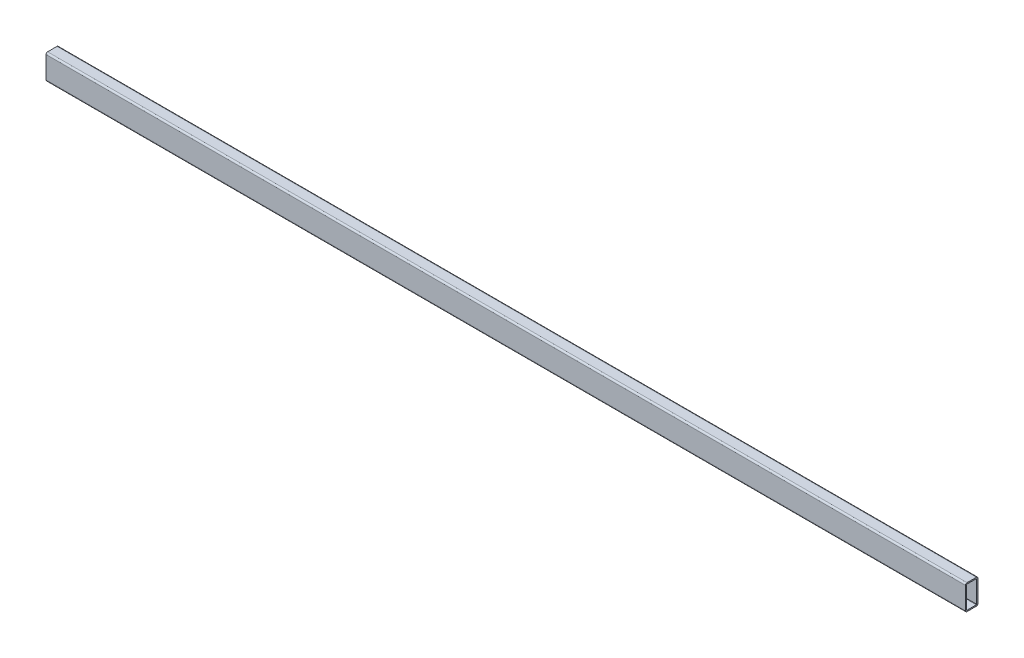
ISO-10303-21;
HEADER;
FILE_DESCRIPTION(('STEP AP214'),'2;1');
FILE_NAME('part.step','',(''),(''),'','','');
FILE_SCHEMA(('AUTOMOTIVE_DESIGN { 1 0 10303 214 1 1 1 1 }'));
ENDSEC;
DATA;
#1=APPLICATION_CONTEXT('core data for automotive mechanical design processes');
#2=APPLICATION_PROTOCOL_DEFINITION('international standard','automotive_design',2000,#1);
#3=PRODUCT_CONTEXT('',#1,'mechanical');
#4=PRODUCT('Part','Part','',(#3));
#5=PRODUCT_RELATED_PRODUCT_CATEGORY('part','',(#4));
#6=PRODUCT_DEFINITION_FORMATION('','',#4);
#7=PRODUCT_DEFINITION_CONTEXT('part definition',#1,'design');
#8=PRODUCT_DEFINITION('design','',#6,#7);
#9=PRODUCT_DEFINITION_SHAPE('','',#8);
#10=(LENGTH_UNIT() NAMED_UNIT(*) SI_UNIT(.MILLI.,.METRE.));
#11=(NAMED_UNIT(*) PLANE_ANGLE_UNIT() SI_UNIT($,.RADIAN.));
#12=(NAMED_UNIT(*) SI_UNIT($,.STERADIAN.) SOLID_ANGLE_UNIT());
#13=UNCERTAINTY_MEASURE_WITH_UNIT(LENGTH_MEASURE(1.E-05),#10,'distance_accuracy_value','');
#14=(GEOMETRIC_REPRESENTATION_CONTEXT(3) GLOBAL_UNCERTAINTY_ASSIGNED_CONTEXT((#13)) GLOBAL_UNIT_ASSIGNED_CONTEXT((#10,
#11,#12)) REPRESENTATION_CONTEXT('',''));
#15=CARTESIAN_POINT('',(0.,0.,0.));
#16=DIRECTION('',(0.,0.,1.));
#17=DIRECTION('',(1.,0.,0.));
#18=AXIS2_PLACEMENT_3D('',#15,#16,#17);
#19=CARTESIAN_POINT('',(732.5,17.5,7.5));
#20=DIRECTION('',(-1.,0.,0.));
#21=DIRECTION('',(0.,0.,1.));
#22=AXIS2_PLACEMENT_3D('',#19,#20,#21);
#23=CYLINDRICAL_SURFACE('',#22,2.5);
#24=CARTESIAN_POINT('',(-732.5,17.5,7.5));
#25=DIRECTION('',(1.,0.,0.));
#26=DIRECTION('',(0.,0.,-1.));
#27=AXIS2_PLACEMENT_3D('',#24,#25,#26);
#28=CIRCLE('',#27,2.5);
#29=CARTESIAN_POINT('',(-732.5,20.,7.5));
#30=VERTEX_POINT('',#29);
#31=CARTESIAN_POINT('',(-732.5,17.5,10.));
#32=VERTEX_POINT('',#31);
#33=EDGE_CURVE('E210',#30,#32,#28,.T.);
#34=ORIENTED_EDGE('',*,*,#33,.T.);
#35=DIRECTION('',(-1.,0.,0.));
#36=VECTOR('',#35,1.);
#37=CARTESIAN_POINT('',(732.5,17.5,10.));
#38=LINE('',#37,#36);
#39=CARTESIAN_POINT('',(732.5,17.5,10.));
#40=VERTEX_POINT('',#39);
#41=EDGE_CURVE('E11',#40,#32,#38,.T.);
#42=ORIENTED_EDGE('',*,*,#41,.F.);
#43=CARTESIAN_POINT('',(732.5,17.5,7.5));
#44=DIRECTION('',(1.,0.,0.));
#45=DIRECTION('',(0.,0.,-1.));
#46=AXIS2_PLACEMENT_3D('',#43,#44,#45);
#47=CIRCLE('',#46,2.5);
#48=CARTESIAN_POINT('',(732.5,20.,7.5));
#49=VERTEX_POINT('',#48);
#50=EDGE_CURVE('E288',#49,#40,#47,.T.);
#51=ORIENTED_EDGE('',*,*,#50,.F.);
#52=DIRECTION('',(-1.,0.,0.));
#53=VECTOR('',#52,1.);
#54=CARTESIAN_POINT('',(732.5,20.,7.5));
#55=LINE('',#54,#53);
#56=EDGE_CURVE('E225',#49,#30,#55,.T.);
#57=ORIENTED_EDGE('',*,*,#56,.T.);
#58=EDGE_LOOP('',(#34,#42,#51,#57));
#59=FACE_BOUND('',#58,.T.);
#60=ADVANCED_FACE('F38',(#59),#23,.T.);
#61=CARTESIAN_POINT('',(732.5,17.5,10.));
#62=DIRECTION('',(0.,0.,-1.));
#63=DIRECTION('',(-1.,0.,0.));
#64=AXIS2_PLACEMENT_3D('',#61,#62,#63);
#65=PLANE('',#64);
#66=DIRECTION('',(0.,-1.,0.));
#67=VECTOR('',#66,1.);
#68=CARTESIAN_POINT('',(-732.5,17.5,10.));
#69=LINE('',#68,#67);
#70=CARTESIAN_POINT('',(-732.5,-17.5,10.));
#71=VERTEX_POINT('',#70);
#72=EDGE_CURVE('E213',#32,#71,#69,.T.);
#73=ORIENTED_EDGE('',*,*,#72,.T.);
#74=DIRECTION('',(-1.,0.,0.));
#75=VECTOR('',#74,1.);
#76=CARTESIAN_POINT('',(732.5,-17.5,10.));
#77=LINE('',#76,#75);
#78=CARTESIAN_POINT('',(732.5,-17.5,10.));
#79=VERTEX_POINT('',#78);
#80=EDGE_CURVE('E48',#79,#71,#77,.T.);
#81=ORIENTED_EDGE('',*,*,#80,.F.);
#82=DIRECTION('',(0.,-1.,0.));
#83=VECTOR('',#82,1.);
#84=CARTESIAN_POINT('',(732.5,17.5,10.));
#85=LINE('',#84,#83);
#86=EDGE_CURVE('E290',#40,#79,#85,.T.);
#87=ORIENTED_EDGE('',*,*,#86,.F.);
#88=ORIENTED_EDGE('',*,*,#41,.T.);
#89=EDGE_LOOP('',(#73,#81,#87,#88));
#90=FACE_BOUND('',#89,.T.);
#91=ADVANCED_FACE('F325',(#90),#65,.F.);
#92=CARTESIAN_POINT('',(732.5,-17.5,7.5));
#93=DIRECTION('',(-1.,0.,0.));
#94=DIRECTION('',(0.,0.,1.));
#95=AXIS2_PLACEMENT_3D('',#92,#93,#94);
#96=CYLINDRICAL_SURFACE('',#95,2.5);
#97=CARTESIAN_POINT('',(-732.5,-17.5,7.5));
#98=DIRECTION('',(1.,0.,0.));
#99=DIRECTION('',(0.,0.,-1.));
#100=AXIS2_PLACEMENT_3D('',#97,#98,#99);
#101=CIRCLE('',#100,2.5);
#102=CARTESIAN_POINT('',(-732.5,-20.,7.5));
#103=VERTEX_POINT('',#102);
#104=EDGE_CURVE('E215',#71,#103,#101,.T.);
#105=ORIENTED_EDGE('',*,*,#104,.T.);
#106=DIRECTION('',(-1.,0.,0.));
#107=VECTOR('',#106,1.);
#108=CARTESIAN_POINT('',(732.5,-20.,7.5));
#109=LINE('',#108,#107);
#110=CARTESIAN_POINT('',(732.5,-20.,7.5));
#111=VERTEX_POINT('',#110);
#112=EDGE_CURVE('E232',#111,#103,#109,.T.);
#113=ORIENTED_EDGE('',*,*,#112,.F.);
#114=CARTESIAN_POINT('',(732.5,-17.5,7.5));
#115=DIRECTION('',(1.,0.,0.));
#116=DIRECTION('',(0.,0.,-1.));
#117=AXIS2_PLACEMENT_3D('',#114,#115,#116);
#118=CIRCLE('',#117,2.5);
#119=EDGE_CURVE('E292',#79,#111,#118,.T.);
#120=ORIENTED_EDGE('',*,*,#119,.F.);
#121=ORIENTED_EDGE('',*,*,#80,.T.);
#122=EDGE_LOOP('',(#105,#113,#120,#121));
#123=FACE_BOUND('',#122,.T.);
#124=ADVANCED_FACE('F330',(#123),#96,.T.);
#125=CARTESIAN_POINT('',(732.5,-20.,-7.5));
#126=DIRECTION('',(0.,1.,0.));
#127=DIRECTION('',(0.,0.,1.));
#128=AXIS2_PLACEMENT_3D('',#125,#126,#127);
#129=PLANE('',#128);
#130=DIRECTION('',(0.,0.,-1.));
#131=VECTOR('',#130,1.);
#132=CARTESIAN_POINT('',(-732.5,-20.,-7.5));
#133=LINE('',#132,#131);
#134=CARTESIAN_POINT('',(-732.5,-20.,-7.5));
#135=VERTEX_POINT('',#134);
#136=EDGE_CURVE('E217',#103,#135,#133,.T.);
#137=ORIENTED_EDGE('',*,*,#136,.T.);
#138=DIRECTION('',(-1.,0.,0.));
#139=VECTOR('',#138,1.);
#140=CARTESIAN_POINT('',(732.5,-20.,-7.5));
#141=LINE('',#140,#139);
#142=CARTESIAN_POINT('',(732.5,-20.,-7.5));
#143=VERTEX_POINT('',#142);
#144=EDGE_CURVE('E229',#143,#135,#141,.T.);
#145=ORIENTED_EDGE('',*,*,#144,.F.);
#146=DIRECTION('',(0.,0.,-1.));
#147=VECTOR('',#146,1.);
#148=CARTESIAN_POINT('',(732.5,-20.,-7.5));
#149=LINE('',#148,#147);
#150=EDGE_CURVE('E294',#111,#143,#149,.T.);
#151=ORIENTED_EDGE('',*,*,#150,.F.);
#152=ORIENTED_EDGE('',*,*,#112,.T.);
#153=EDGE_LOOP('',(#137,#145,#151,#152));
#154=FACE_BOUND('',#153,.T.);
#155=ADVANCED_FACE('F300',(#154),#129,.F.);
#156=CARTESIAN_POINT('',(732.5,-17.5,-7.5));
#157=DIRECTION('',(-1.,0.,0.));
#158=DIRECTION('',(0.,0.,1.));
#159=AXIS2_PLACEMENT_3D('',#156,#157,#158);
#160=CYLINDRICAL_SURFACE('',#159,2.5);
#161=CARTESIAN_POINT('',(-732.5,-17.5,-7.5));
#162=DIRECTION('',(1.,0.,0.));
#163=DIRECTION('',(0.,0.,-1.));
#164=AXIS2_PLACEMENT_3D('',#161,#162,#163);
#165=CIRCLE('',#164,2.5);
#166=CARTESIAN_POINT('',(-732.5,-17.5,-10.));
#167=VERTEX_POINT('',#166);
#168=EDGE_CURVE('E219',#135,#167,#165,.T.);
#169=ORIENTED_EDGE('',*,*,#168,.T.);
#170=DIRECTION('',(-1.,0.,0.));
#171=VECTOR('',#170,1.);
#172=CARTESIAN_POINT('',(732.5,-17.5,-10.));
#173=LINE('',#172,#171);
#174=CARTESIAN_POINT('',(732.5,-17.5,-10.));
#175=VERTEX_POINT('',#174);
#176=EDGE_CURVE('E177',#175,#167,#173,.T.);
#177=ORIENTED_EDGE('',*,*,#176,.F.);
#178=CARTESIAN_POINT('',(732.5,-17.5,-7.5));
#179=DIRECTION('',(1.,0.,0.));
#180=DIRECTION('',(0.,0.,-1.));
#181=AXIS2_PLACEMENT_3D('',#178,#179,#180);
#182=CIRCLE('',#181,2.5);
#183=EDGE_CURVE('E168',#143,#175,#182,.T.);
#184=ORIENTED_EDGE('',*,*,#183,.F.);
#185=ORIENTED_EDGE('',*,*,#144,.T.);
#186=EDGE_LOOP('',(#169,#177,#184,#185));
#187=FACE_BOUND('',#186,.T.);
#188=ADVANCED_FACE('F304',(#187),#160,.T.);
#189=CARTESIAN_POINT('',(732.5,-17.5,-10.));
#190=DIRECTION('',(0.,0.,1.));
#191=DIRECTION('',(1.,0.,0.));
#192=AXIS2_PLACEMENT_3D('',#189,#190,#191);
#193=PLANE('',#192);
#194=DIRECTION('',(0.,1.,0.));
#195=VECTOR('',#194,1.);
#196=CARTESIAN_POINT('',(-732.5,-17.5,-10.));
#197=LINE('',#196,#195);
#198=CARTESIAN_POINT('',(-732.5,17.5,-10.));
#199=VERTEX_POINT('',#198);
#200=EDGE_CURVE('E176',#167,#199,#197,.T.);
#201=ORIENTED_EDGE('',*,*,#200,.T.);
#202=DIRECTION('',(-1.,0.,0.));
#203=VECTOR('',#202,1.);
#204=CARTESIAN_POINT('',(732.5,17.5,-10.));
#205=LINE('',#204,#203);
#206=CARTESIAN_POINT('',(732.5,17.5,-10.));
#207=VERTEX_POINT('',#206);
#208=EDGE_CURVE('E173',#207,#199,#205,.T.);
#209=ORIENTED_EDGE('',*,*,#208,.F.);
#210=DIRECTION('',(0.,1.,0.));
#211=VECTOR('',#210,1.);
#212=CARTESIAN_POINT('',(732.5,-17.5,-10.));
#213=LINE('',#212,#211);
#214=EDGE_CURVE('E162',#175,#207,#213,.T.);
#215=ORIENTED_EDGE('',*,*,#214,.F.);
#216=ORIENTED_EDGE('',*,*,#176,.T.);
#217=EDGE_LOOP('',(#201,#209,#215,#216));
#218=FACE_BOUND('',#217,.T.);
#219=ADVANCED_FACE('F174',(#218),#193,.F.);
#220=CARTESIAN_POINT('',(732.5,17.5,-7.5));
#221=DIRECTION('',(-1.,0.,0.));
#222=DIRECTION('',(0.,0.,1.));
#223=AXIS2_PLACEMENT_3D('',#220,#221,#222);
#224=CYLINDRICAL_SURFACE('',#223,2.5);
#225=CARTESIAN_POINT('',(-732.5,17.5,-7.5));
#226=DIRECTION('',(1.,0.,0.));
#227=DIRECTION('',(0.,0.,-1.));
#228=AXIS2_PLACEMENT_3D('',#225,#226,#227);
#229=CIRCLE('',#228,2.5);
#230=CARTESIAN_POINT('',(-732.5,20.,-7.5));
#231=VERTEX_POINT('',#230);
#232=EDGE_CURVE('E110',#199,#231,#229,.T.);
#233=ORIENTED_EDGE('',*,*,#232,.T.);
#234=DIRECTION('',(-1.,0.,0.));
#235=VECTOR('',#234,1.);
#236=CARTESIAN_POINT('',(732.5,20.,-7.5));
#237=LINE('',#236,#235);
#238=CARTESIAN_POINT('',(732.5,20.,-7.5));
#239=VERTEX_POINT('',#238);
#240=EDGE_CURVE('E178',#239,#231,#237,.T.);
#241=ORIENTED_EDGE('',*,*,#240,.F.);
#242=CARTESIAN_POINT('',(732.5,17.5,-7.5));
#243=DIRECTION('',(1.,0.,0.));
#244=DIRECTION('',(0.,0.,-1.));
#245=AXIS2_PLACEMENT_3D('',#242,#243,#244);
#246=CIRCLE('',#245,2.5);
#247=EDGE_CURVE('E166',#207,#239,#246,.T.);
#248=ORIENTED_EDGE('',*,*,#247,.F.);
#249=ORIENTED_EDGE('',*,*,#208,.T.);
#250=EDGE_LOOP('',(#233,#241,#248,#249));
#251=FACE_BOUND('',#250,.T.);
#252=ADVANCED_FACE('F180',(#251),#224,.T.);
#253=CARTESIAN_POINT('',(732.5,-17.5,7.5));
#254=DIRECTION('',(-1.,0.,0.));
#255=DIRECTION('',(0.,0.,1.));
#256=AXIS2_PLACEMENT_3D('',#253,#254,#255);
#257=CYLINDRICAL_SURFACE('',#256,0.499999999999998);
#258=CARTESIAN_POINT('',(-732.5,-17.5,7.5));
#259=DIRECTION('',(1.,0.,0.));
#260=DIRECTION('',(0.,0.,-1.));
#261=AXIS2_PLACEMENT_3D('',#258,#259,#260);
#262=CIRCLE('',#261,0.499999999999998);
#263=CARTESIAN_POINT('',(-732.5,-17.5,8.));
#264=VERTEX_POINT('',#263);
#265=CARTESIAN_POINT('',(-732.5,-18.,7.5));
#266=VERTEX_POINT('',#265);
#267=EDGE_CURVE('E186',#264,#266,#262,.T.);
#268=ORIENTED_EDGE('',*,*,#267,.F.);
#269=DIRECTION('',(-1.,0.,0.));
#270=VECTOR('',#269,1.);
#271=CARTESIAN_POINT('',(732.5,-17.5,8.));
#272=LINE('',#271,#270);
#273=CARTESIAN_POINT('',(732.5,-17.5,8.));
#274=VERTEX_POINT('',#273);
#275=EDGE_CURVE('E42',#274,#264,#272,.T.);
#276=ORIENTED_EDGE('',*,*,#275,.F.);
#277=CARTESIAN_POINT('',(732.5,-17.5,7.5));
#278=DIRECTION('',(1.,0.,0.));
#279=DIRECTION('',(0.,0.,-1.));
#280=AXIS2_PLACEMENT_3D('',#277,#278,#279);
#281=CIRCLE('',#280,0.499999999999998);
#282=CARTESIAN_POINT('',(732.5,-18.,7.5));
#283=VERTEX_POINT('',#282);
#284=EDGE_CURVE('E224',#274,#283,#281,.T.);
#285=ORIENTED_EDGE('',*,*,#284,.T.);
#286=DIRECTION('',(-1.,0.,0.));
#287=VECTOR('',#286,1.);
#288=CARTESIAN_POINT('',(732.5,-18.,7.5));
#289=LINE('',#288,#287);
#290=EDGE_CURVE('E182',#283,#266,#289,.T.);
#291=ORIENTED_EDGE('',*,*,#290,.T.);
#292=EDGE_LOOP('',(#268,#276,#285,#291));
#293=FACE_BOUND('',#292,.T.);
#294=ADVANCED_FACE('F40',(#293),#257,.F.);
#295=CARTESIAN_POINT('',(732.5,17.5,8.));
#296=DIRECTION('',(0.,0.,-1.));
#297=DIRECTION('',(-1.,0.,0.));
#298=AXIS2_PLACEMENT_3D('',#295,#296,#297);
#299=PLANE('',#298);
#300=DIRECTION('',(0.,-1.,0.));
#301=VECTOR('',#300,1.);
#302=CARTESIAN_POINT('',(-732.5,17.5,8.));
#303=LINE('',#302,#301);
#304=CARTESIAN_POINT('',(-732.5,17.5,8.));
#305=VERTEX_POINT('',#304);
#306=EDGE_CURVE('E189',#305,#264,#303,.T.);
#307=ORIENTED_EDGE('',*,*,#306,.F.);
#308=DIRECTION('',(-1.,0.,0.));
#309=VECTOR('',#308,1.);
#310=CARTESIAN_POINT('',(732.5,17.5,8.));
#311=LINE('',#310,#309);
#312=CARTESIAN_POINT('',(732.5,17.5,8.));
#313=VERTEX_POINT('',#312);
#314=EDGE_CURVE('E247',#313,#305,#311,.T.);
#315=ORIENTED_EDGE('',*,*,#314,.F.);
#316=DIRECTION('',(0.,-1.,0.));
#317=VECTOR('',#316,1.);
#318=CARTESIAN_POINT('',(732.5,17.5,8.));
#319=LINE('',#318,#317);
#320=EDGE_CURVE('E256',#313,#274,#319,.T.);
#321=ORIENTED_EDGE('',*,*,#320,.T.);
#322=ORIENTED_EDGE('',*,*,#275,.T.);
#323=EDGE_LOOP('',(#307,#315,#321,#322));
#324=FACE_BOUND('',#323,.T.);
#325=ADVANCED_FACE('F254',(#324),#299,.T.);
#326=CARTESIAN_POINT('',(732.5,17.5,7.5));
#327=DIRECTION('',(-1.,0.,0.));
#328=DIRECTION('',(0.,0.,1.));
#329=AXIS2_PLACEMENT_3D('',#326,#327,#328);
#330=CYLINDRICAL_SURFACE('',#329,0.499999999999998);
#331=CARTESIAN_POINT('',(-732.5,17.5,7.5));
#332=DIRECTION('',(1.,0.,0.));
#333=DIRECTION('',(0.,0.,-1.));
#334=AXIS2_PLACEMENT_3D('',#331,#332,#333);
#335=CIRCLE('',#334,0.499999999999998);
#336=CARTESIAN_POINT('',(-732.5,18.,7.5));
#337=VERTEX_POINT('',#336);
#338=EDGE_CURVE('E192',#337,#305,#335,.T.);
#339=ORIENTED_EDGE('',*,*,#338,.F.);
#340=DIRECTION('',(-1.,0.,0.));
#341=VECTOR('',#340,1.);
#342=CARTESIAN_POINT('',(732.5,18.,7.5));
#343=LINE('',#342,#341);
#344=CARTESIAN_POINT('',(732.5,18.,7.5));
#345=VERTEX_POINT('',#344);
#346=EDGE_CURVE('E246',#345,#337,#343,.T.);
#347=ORIENTED_EDGE('',*,*,#346,.F.);
#348=CARTESIAN_POINT('',(732.5,17.5,7.5));
#349=DIRECTION('',(1.,0.,0.));
#350=DIRECTION('',(0.,0.,-1.));
#351=AXIS2_PLACEMENT_3D('',#348,#349,#350);
#352=CIRCLE('',#351,0.499999999999998);
#353=EDGE_CURVE('E264',#345,#313,#352,.T.);
#354=ORIENTED_EDGE('',*,*,#353,.T.);
#355=ORIENTED_EDGE('',*,*,#314,.T.);
#356=EDGE_LOOP('',(#339,#347,#354,#355));
#357=FACE_BOUND('',#356,.T.);
#358=ADVANCED_FACE('F262',(#357),#330,.F.);
#359=CARTESIAN_POINT('',(732.5,18.,7.5));
#360=DIRECTION('',(0.,-1.,0.));
#361=DIRECTION('',(0.,0.,-1.));
#362=AXIS2_PLACEMENT_3D('',#359,#360,#361);
#363=PLANE('',#362);
#364=DIRECTION('',(0.,0.,1.));
#365=VECTOR('',#364,1.);
#366=CARTESIAN_POINT('',(-732.5,18.,7.5));
#367=LINE('',#366,#365);
#368=CARTESIAN_POINT('',(-732.5,18.,-7.5));
#369=VERTEX_POINT('',#368);
#370=EDGE_CURVE('E195',#369,#337,#367,.T.);
#371=ORIENTED_EDGE('',*,*,#370,.F.);
#372=DIRECTION('',(-1.,0.,0.));
#373=VECTOR('',#372,1.);
#374=CARTESIAN_POINT('',(732.5,18.,-7.5));
#375=LINE('',#374,#373);
#376=CARTESIAN_POINT('',(732.5,18.,-7.5));
#377=VERTEX_POINT('',#376);
#378=EDGE_CURVE('E244',#377,#369,#375,.T.);
#379=ORIENTED_EDGE('',*,*,#378,.F.);
#380=DIRECTION('',(0.,0.,1.));
#381=VECTOR('',#380,1.);
#382=CARTESIAN_POINT('',(732.5,18.,7.5));
#383=LINE('',#382,#381);
#384=EDGE_CURVE('E270',#377,#345,#383,.T.);
#385=ORIENTED_EDGE('',*,*,#384,.T.);
#386=ORIENTED_EDGE('',*,*,#346,.T.);
#387=EDGE_LOOP('',(#371,#379,#385,#386));
#388=FACE_BOUND('',#387,.T.);
#389=ADVANCED_FACE('F273',(#388),#363,.T.);
#390=CARTESIAN_POINT('',(732.5,17.5,-7.5));
#391=DIRECTION('',(-1.,0.,0.));
#392=DIRECTION('',(0.,0.,1.));
#393=AXIS2_PLACEMENT_3D('',#390,#391,#392);
#394=CYLINDRICAL_SURFACE('',#393,0.499999999999998);
#395=CARTESIAN_POINT('',(-732.5,17.5,-7.5));
#396=DIRECTION('',(1.,0.,0.));
#397=DIRECTION('',(0.,0.,-1.));
#398=AXIS2_PLACEMENT_3D('',#395,#396,#397);
#399=CIRCLE('',#398,0.499999999999998);
#400=CARTESIAN_POINT('',(-732.5,17.5,-8.));
#401=VERTEX_POINT('',#400);
#402=EDGE_CURVE('E198',#401,#369,#399,.T.);
#403=ORIENTED_EDGE('',*,*,#402,.F.);
#404=DIRECTION('',(-1.,0.,0.));
#405=VECTOR('',#404,1.);
#406=CARTESIAN_POINT('',(732.5,17.5,-8.));
#407=LINE('',#406,#405);
#408=CARTESIAN_POINT('',(732.5,17.5,-8.));
#409=VERTEX_POINT('',#408);
#410=EDGE_CURVE('E242',#409,#401,#407,.T.);
#411=ORIENTED_EDGE('',*,*,#410,.F.);
#412=CARTESIAN_POINT('',(732.5,17.5,-7.5));
#413=DIRECTION('',(1.,0.,0.));
#414=DIRECTION('',(0.,0.,-1.));
#415=AXIS2_PLACEMENT_3D('',#412,#413,#414);
#416=CIRCLE('',#415,0.499999999999998);
#417=EDGE_CURVE('E274',#409,#377,#416,.T.);
#418=ORIENTED_EDGE('',*,*,#417,.T.);
#419=ORIENTED_EDGE('',*,*,#378,.T.);
#420=EDGE_LOOP('',(#403,#411,#418,#419));
#421=FACE_BOUND('',#420,.T.);
#422=ADVANCED_FACE('F341',(#421),#394,.F.);
#423=CARTESIAN_POINT('',(732.5,-17.5,-8.));
#424=DIRECTION('',(0.,0.,1.));
#425=DIRECTION('',(1.,0.,0.));
#426=AXIS2_PLACEMENT_3D('',#423,#424,#425);
#427=PLANE('',#426);
#428=DIRECTION('',(0.,1.,0.));
#429=VECTOR('',#428,1.);
#430=CARTESIAN_POINT('',(-732.5,-17.5,-8.));
#431=LINE('',#430,#429);
#432=CARTESIAN_POINT('',(-732.5,-17.5,-8.));
#433=VERTEX_POINT('',#432);
#434=EDGE_CURVE('E201',#433,#401,#431,.T.);
#435=ORIENTED_EDGE('',*,*,#434,.F.);
#436=DIRECTION('',(-1.,0.,0.));
#437=VECTOR('',#436,1.);
#438=CARTESIAN_POINT('',(732.5,-17.5,-8.));
#439=LINE('',#438,#437);
#440=CARTESIAN_POINT('',(732.5,-17.5,-8.));
#441=VERTEX_POINT('',#440);
#442=EDGE_CURVE('E240',#441,#433,#439,.T.);
#443=ORIENTED_EDGE('',*,*,#442,.F.);
#444=DIRECTION('',(0.,1.,0.));
#445=VECTOR('',#444,1.);
#446=CARTESIAN_POINT('',(732.5,-17.5,-8.));
#447=LINE('',#446,#445);
#448=EDGE_CURVE('E276',#441,#409,#447,.T.);
#449=ORIENTED_EDGE('',*,*,#448,.T.);
#450=ORIENTED_EDGE('',*,*,#410,.T.);
#451=EDGE_LOOP('',(#435,#443,#449,#450));
#452=FACE_BOUND('',#451,.T.);
#453=ADVANCED_FACE('F337',(#452),#427,.T.);
#454=CARTESIAN_POINT('',(732.5,-17.5,-7.5));
#455=DIRECTION('',(-1.,0.,0.));
#456=DIRECTION('',(0.,0.,1.));
#457=AXIS2_PLACEMENT_3D('',#454,#455,#456);
#458=CYLINDRICAL_SURFACE('',#457,0.499999999999998);
#459=CARTESIAN_POINT('',(-732.5,-17.5,-7.5));
#460=DIRECTION('',(1.,0.,0.));
#461=DIRECTION('',(0.,0.,-1.));
#462=AXIS2_PLACEMENT_3D('',#459,#460,#461);
#463=CIRCLE('',#462,0.499999999999998);
#464=CARTESIAN_POINT('',(-732.5,-18.,-7.5));
#465=VERTEX_POINT('',#464);
#466=EDGE_CURVE('E204',#465,#433,#463,.T.);
#467=ORIENTED_EDGE('',*,*,#466,.F.);
#468=DIRECTION('',(-1.,0.,0.));
#469=VECTOR('',#468,1.);
#470=CARTESIAN_POINT('',(732.5,-18.,-7.5));
#471=LINE('',#470,#469);
#472=CARTESIAN_POINT('',(732.5,-18.,-7.5));
#473=VERTEX_POINT('',#472);
#474=EDGE_CURVE('E238',#473,#465,#471,.T.);
#475=ORIENTED_EDGE('',*,*,#474,.F.);
#476=CARTESIAN_POINT('',(732.5,-17.5,-7.5));
#477=DIRECTION('',(1.,0.,0.));
#478=DIRECTION('',(0.,0.,-1.));
#479=AXIS2_PLACEMENT_3D('',#476,#477,#478);
#480=CIRCLE('',#479,0.499999999999998);
#481=EDGE_CURVE('E282',#473,#441,#480,.T.);
#482=ORIENTED_EDGE('',*,*,#481,.T.);
#483=ORIENTED_EDGE('',*,*,#442,.T.);
#484=EDGE_LOOP('',(#467,#475,#482,#483));
#485=FACE_BOUND('',#484,.T.);
#486=ADVANCED_FACE('F319',(#485),#458,.F.);
#487=CARTESIAN_POINT('',(732.5,-18.,-7.5));
#488=DIRECTION('',(0.,1.,0.));
#489=DIRECTION('',(0.,0.,1.));
#490=AXIS2_PLACEMENT_3D('',#487,#488,#489);
#491=PLANE('',#490);
#492=DIRECTION('',(0.,0.,-1.));
#493=VECTOR('',#492,1.);
#494=CARTESIAN_POINT('',(-732.5,-18.,-7.5));
#495=LINE('',#494,#493);
#496=EDGE_CURVE('E207',#266,#465,#495,.T.);
#497=ORIENTED_EDGE('',*,*,#496,.F.);
#498=ORIENTED_EDGE('',*,*,#290,.F.);
#499=DIRECTION('',(0.,0.,-1.));
#500=VECTOR('',#499,1.);
#501=CARTESIAN_POINT('',(732.5,-18.,-7.5));
#502=LINE('',#501,#500);
#503=EDGE_CURVE('E285',#283,#473,#502,.T.);
#504=ORIENTED_EDGE('',*,*,#503,.T.);
#505=ORIENTED_EDGE('',*,*,#474,.T.);
#506=EDGE_LOOP('',(#497,#498,#504,#505));
#507=FACE_BOUND('',#506,.T.);
#508=ADVANCED_FACE('F312',(#507),#491,.T.);
#509=CARTESIAN_POINT('',(732.5,20.,7.5));
#510=DIRECTION('',(0.,-1.,0.));
#511=DIRECTION('',(0.,0.,-1.));
#512=AXIS2_PLACEMENT_3D('',#509,#510,#511);
#513=PLANE('',#512);
#514=DIRECTION('',(0.,0.,1.));
#515=VECTOR('',#514,1.);
#516=CARTESIAN_POINT('',(-732.5,20.,7.5));
#517=LINE('',#516,#515);
#518=EDGE_CURVE('E116',#231,#30,#517,.T.);
#519=ORIENTED_EDGE('',*,*,#518,.T.);
#520=ORIENTED_EDGE('',*,*,#56,.F.);
#521=DIRECTION('',(0.,0.,1.));
#522=VECTOR('',#521,1.);
#523=CARTESIAN_POINT('',(732.5,20.,7.5));
#524=LINE('',#523,#522);
#525=EDGE_CURVE('E57',#239,#49,#524,.T.);
#526=ORIENTED_EDGE('',*,*,#525,.F.);
#527=ORIENTED_EDGE('',*,*,#240,.T.);
#528=EDGE_LOOP('',(#519,#520,#526,#527));
#529=FACE_BOUND('',#528,.T.);
#530=ADVANCED_FACE('F310',(#529),#513,.F.);
#531=CARTESIAN_POINT('',(732.5,17.5,7.5));
#532=DIRECTION('',(1.,0.,0.));
#533=DIRECTION('',(0.,0.,-1.));
#534=AXIS2_PLACEMENT_3D('',#531,#532,#533);
#535=PLANE('',#534);
#536=ORIENTED_EDGE('',*,*,#284,.F.);
#537=ORIENTED_EDGE('',*,*,#320,.F.);
#538=ORIENTED_EDGE('',*,*,#353,.F.);
#539=ORIENTED_EDGE('',*,*,#384,.F.);
#540=ORIENTED_EDGE('',*,*,#417,.F.);
#541=ORIENTED_EDGE('',*,*,#448,.F.);
#542=ORIENTED_EDGE('',*,*,#481,.F.);
#543=ORIENTED_EDGE('',*,*,#503,.F.);
#544=EDGE_LOOP('',(#536,#537,#538,#539,#540,#541,#542,#543));
#545=FACE_BOUND('',#544,.T.);
#546=ORIENTED_EDGE('',*,*,#50,.T.);
#547=ORIENTED_EDGE('',*,*,#86,.T.);
#548=ORIENTED_EDGE('',*,*,#119,.T.);
#549=ORIENTED_EDGE('',*,*,#150,.T.);
#550=ORIENTED_EDGE('',*,*,#183,.T.);
#551=ORIENTED_EDGE('',*,*,#214,.T.);
#552=ORIENTED_EDGE('',*,*,#247,.T.);
#553=ORIENTED_EDGE('',*,*,#525,.T.);
#554=EDGE_LOOP('',(#546,#547,#548,#549,#550,#551,#552,#553));
#555=FACE_BOUND('',#554,.T.);
#556=ADVANCED_FACE('F164',(#545,#555),#535,.T.);
#557=CARTESIAN_POINT('',(-732.5,17.5,7.5));
#558=DIRECTION('',(1.,0.,0.));
#559=DIRECTION('',(0.,0.,-1.));
#560=AXIS2_PLACEMENT_3D('',#557,#558,#559);
#561=PLANE('',#560);
#562=ORIENTED_EDGE('',*,*,#267,.T.);
#563=ORIENTED_EDGE('',*,*,#496,.T.);
#564=ORIENTED_EDGE('',*,*,#466,.T.);
#565=ORIENTED_EDGE('',*,*,#434,.T.);
#566=ORIENTED_EDGE('',*,*,#402,.T.);
#567=ORIENTED_EDGE('',*,*,#370,.T.);
#568=ORIENTED_EDGE('',*,*,#338,.T.);
#569=ORIENTED_EDGE('',*,*,#306,.T.);
#570=EDGE_LOOP('',(#562,#563,#564,#565,#566,#567,#568,#569));
#571=FACE_BOUND('',#570,.T.);
#572=ORIENTED_EDGE('',*,*,#33,.F.);
#573=ORIENTED_EDGE('',*,*,#518,.F.);
#574=ORIENTED_EDGE('',*,*,#232,.F.);
#575=ORIENTED_EDGE('',*,*,#200,.F.);
#576=ORIENTED_EDGE('',*,*,#168,.F.);
#577=ORIENTED_EDGE('',*,*,#136,.F.);
#578=ORIENTED_EDGE('',*,*,#104,.F.);
#579=ORIENTED_EDGE('',*,*,#72,.F.);
#580=EDGE_LOOP('',(#572,#573,#574,#575,#576,#577,#578,#579));
#581=FACE_BOUND('',#580,.T.);
#582=ADVANCED_FACE('F259',(#571,#581),#561,.F.);
#583=CLOSED_SHELL('',(#60,#91,#124,#155,#188,#219,#252,#294,#325,#358,#389,#422,#453,#486,#508,
#530,#556,#582));
#584=MANIFOLD_SOLID_BREP('B2',#583);
#585=ADVANCED_BREP_SHAPE_REPRESENTATION('',(#18,#584),#14);
#586=SHAPE_DEFINITION_REPRESENTATION(#9,#585);
ENDSEC;
END-ISO-10303-21;
